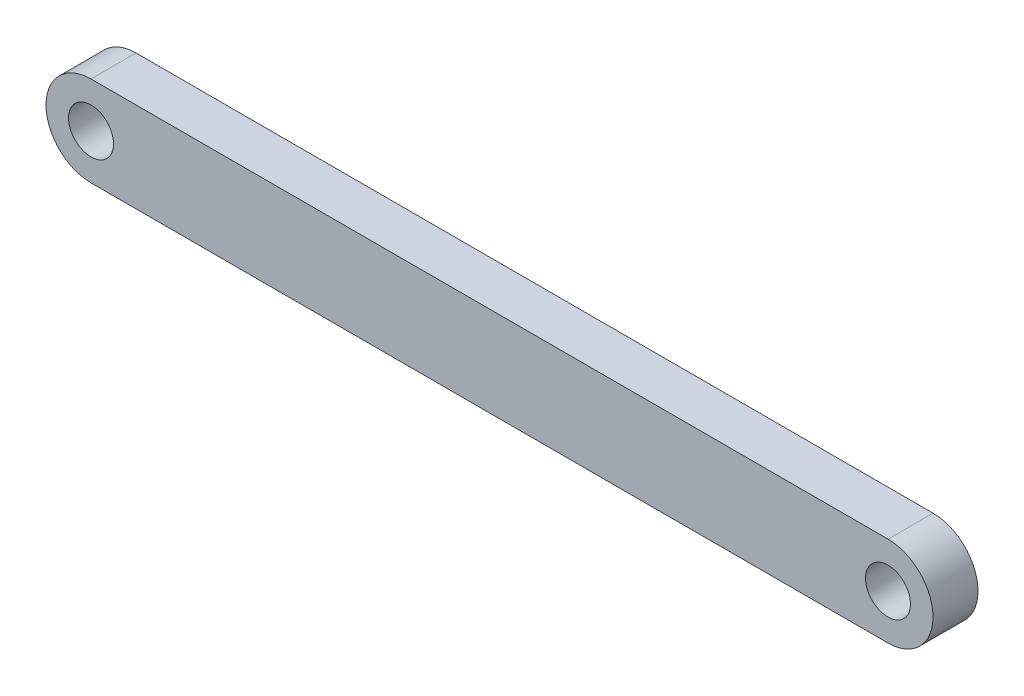
ISO-10303-21;
HEADER;
FILE_DESCRIPTION(('STEP AP214'),'2;1');
FILE_NAME('part.step','',(''),(''),'','','');
FILE_SCHEMA(('AUTOMOTIVE_DESIGN { 1 0 10303 214 1 1 1 1 }'));
ENDSEC;
DATA;
#1=APPLICATION_CONTEXT('core data for automotive mechanical design processes');
#2=APPLICATION_PROTOCOL_DEFINITION('international standard','automotive_design',2000,#1);
#3=PRODUCT_CONTEXT('',#1,'mechanical');
#4=PRODUCT('Part','Part','',(#3));
#5=PRODUCT_RELATED_PRODUCT_CATEGORY('part','',(#4));
#6=PRODUCT_DEFINITION_FORMATION('','',#4);
#7=PRODUCT_DEFINITION_CONTEXT('part definition',#1,'design');
#8=PRODUCT_DEFINITION('design','',#6,#7);
#9=PRODUCT_DEFINITION_SHAPE('','',#8);
#10=(LENGTH_UNIT() NAMED_UNIT(*) SI_UNIT(.MILLI.,.METRE.));
#11=(NAMED_UNIT(*) PLANE_ANGLE_UNIT() SI_UNIT($,.RADIAN.));
#12=(NAMED_UNIT(*) SI_UNIT($,.STERADIAN.) SOLID_ANGLE_UNIT());
#13=UNCERTAINTY_MEASURE_WITH_UNIT(LENGTH_MEASURE(1.E-05),#10,'distance_accuracy_value','');
#14=(GEOMETRIC_REPRESENTATION_CONTEXT(3) GLOBAL_UNCERTAINTY_ASSIGNED_CONTEXT((#13)) GLOBAL_UNIT_ASSIGNED_CONTEXT((#10,
#11,#12)) REPRESENTATION_CONTEXT('',''));
#15=CARTESIAN_POINT('',(0.,0.,0.));
#16=DIRECTION('',(0.,0.,1.));
#17=DIRECTION('',(1.,0.,0.));
#18=AXIS2_PLACEMENT_3D('',#15,#16,#17);
#19=CARTESIAN_POINT('',(-17.7099999764253,0.000913792037537602,2.));
#20=DIRECTION('',(0.,0.,1.));
#21=DIRECTION('',(1.,0.,0.));
#22=AXIS2_PLACEMENT_3D('',#19,#20,#21);
#23=PLANE('',#22);
#24=CARTESIAN_POINT('',(-17.7099999764253,0.000913792037537602,2.));
#25=DIRECTION('',(0.,0.,1.));
#26=DIRECTION('',(1.,0.,0.));
#27=AXIS2_PLACEMENT_3D('',#24,#25,#26);
#28=CIRCLE('',#27,1.);
#29=CARTESIAN_POINT('',(-16.7099999764253,0.000913792037537602,2.));
#30=VERTEX_POINT('',#29);
#31=EDGE_CURVE('E100',#30,#30,#28,.T.);
#32=ORIENTED_EDGE('',*,*,#31,.F.);
#33=EDGE_LOOP('',(#32));
#34=FACE_BOUND('',#33,.T.);
#35=CARTESIAN_POINT('',(-17.7099999764253,0.000913792037537602,2.));
#36=DIRECTION('',(0.,0.,1.));
#37=DIRECTION('',(1.,0.,0.));
#38=AXIS2_PLACEMENT_3D('',#35,#36,#37);
#39=CIRCLE('',#38,2.);
#40=CARTESIAN_POINT('',(-17.7099999764253,2.00091379203754,2.));
#41=VERTEX_POINT('',#40);
#42=CARTESIAN_POINT('',(-17.7099999764253,-1.99908620796246,2.));
#43=VERTEX_POINT('',#42);
#44=EDGE_CURVE('E85',#41,#43,#39,.T.);
#45=ORIENTED_EDGE('',*,*,#44,.T.);
#46=DIRECTION('',(1.,0.,0.));
#47=VECTOR('',#46,1.);
#48=CARTESIAN_POINT('',(-17.7099999764253,-1.99908620796246,2.));
#49=LINE('',#48,#47);
#50=CARTESIAN_POINT('',(17.7100000235747,-1.99908620796246,2.));
#51=VERTEX_POINT('',#50);
#52=EDGE_CURVE('E80',#43,#51,#49,.T.);
#53=ORIENTED_EDGE('',*,*,#52,.T.);
#54=CARTESIAN_POINT('',(17.7100000235747,0.000913792037537602,2.));
#55=DIRECTION('',(0.,0.,1.));
#56=DIRECTION('',(1.,0.,0.));
#57=AXIS2_PLACEMENT_3D('',#54,#55,#56);
#58=CIRCLE('',#57,2.);
#59=CARTESIAN_POINT('',(17.7100000235747,2.00091379203754,2.));
#60=VERTEX_POINT('',#59);
#61=EDGE_CURVE('E83',#51,#60,#58,.T.);
#62=ORIENTED_EDGE('',*,*,#61,.T.);
#63=DIRECTION('',(-1.,0.,0.));
#64=VECTOR('',#63,1.);
#65=CARTESIAN_POINT('',(-17.7099999764253,2.00091379203754,2.));
#66=LINE('',#65,#64);
#67=EDGE_CURVE('E50',#60,#41,#66,.T.);
#68=ORIENTED_EDGE('',*,*,#67,.T.);
#69=EDGE_LOOP('',(#45,#53,#62,#68));
#70=FACE_BOUND('',#69,.T.);
#71=CARTESIAN_POINT('',(17.7100000235747,0.000913792037537602,2.));
#72=DIRECTION('',(0.,0.,1.));
#73=DIRECTION('',(1.,0.,0.));
#74=AXIS2_PLACEMENT_3D('',#71,#72,#73);
#75=CIRCLE('',#74,1.);
#76=CARTESIAN_POINT('',(18.7100000235747,0.000913792037537602,2.));
#77=VERTEX_POINT('',#76);
#78=EDGE_CURVE('E115',#77,#77,#75,.T.);
#79=ORIENTED_EDGE('',*,*,#78,.F.);
#80=EDGE_LOOP('',(#79));
#81=FACE_BOUND('',#80,.T.);
#82=ADVANCED_FACE('F33',(#34,#70,#81),#23,.T.);
#83=CARTESIAN_POINT('',(-17.7099999764253,0.000913792037537602,0.));
#84=DIRECTION('',(0.,0.,1.));
#85=DIRECTION('',(1.,0.,0.));
#86=AXIS2_PLACEMENT_3D('',#83,#84,#85);
#87=PLANE('',#86);
#88=CARTESIAN_POINT('',(-17.7099999764253,0.000913792037537602,0.));
#89=DIRECTION('',(0.,0.,1.));
#90=DIRECTION('',(1.,0.,0.));
#91=AXIS2_PLACEMENT_3D('',#88,#89,#90);
#92=CIRCLE('',#91,2.);
#93=CARTESIAN_POINT('',(-17.7099999764253,2.00091379203754,0.));
#94=VERTEX_POINT('',#93);
#95=CARTESIAN_POINT('',(-17.7099999764253,-1.99908620796246,0.));
#96=VERTEX_POINT('',#95);
#97=EDGE_CURVE('E97',#94,#96,#92,.T.);
#98=ORIENTED_EDGE('',*,*,#97,.F.);
#99=DIRECTION('',(-1.,0.,0.));
#100=VECTOR('',#99,1.);
#101=CARTESIAN_POINT('',(-17.7099999764253,2.00091379203754,0.));
#102=LINE('',#101,#100);
#103=CARTESIAN_POINT('',(17.7100000235747,2.00091379203754,0.));
#104=VERTEX_POINT('',#103);
#105=EDGE_CURVE('E73',#104,#94,#102,.T.);
#106=ORIENTED_EDGE('',*,*,#105,.F.);
#107=CARTESIAN_POINT('',(17.7100000235747,0.000913792037537602,0.));
#108=DIRECTION('',(0.,0.,1.));
#109=DIRECTION('',(1.,0.,0.));
#110=AXIS2_PLACEMENT_3D('',#107,#108,#109);
#111=CIRCLE('',#110,2.);
#112=CARTESIAN_POINT('',(17.7100000235747,-1.99908620796246,0.));
#113=VERTEX_POINT('',#112);
#114=EDGE_CURVE('E67',#113,#104,#111,.T.);
#115=ORIENTED_EDGE('',*,*,#114,.F.);
#116=DIRECTION('',(1.,0.,0.));
#117=VECTOR('',#116,1.);
#118=CARTESIAN_POINT('',(-17.7099999764253,-1.99908620796246,0.));
#119=LINE('',#118,#117);
#120=EDGE_CURVE('E89',#96,#113,#119,.T.);
#121=ORIENTED_EDGE('',*,*,#120,.F.);
#122=EDGE_LOOP('',(#98,#106,#115,#121));
#123=FACE_BOUND('',#122,.T.);
#124=CARTESIAN_POINT('',(-17.7099999764253,0.000913792037537602,0.));
#125=DIRECTION('',(0.,0.,1.));
#126=DIRECTION('',(1.,0.,0.));
#127=AXIS2_PLACEMENT_3D('',#124,#125,#126);
#128=CIRCLE('',#127,1.);
#129=CARTESIAN_POINT('',(-16.7099999764253,0.000913792037537602,0.));
#130=VERTEX_POINT('',#129);
#131=EDGE_CURVE('E112',#130,#130,#128,.T.);
#132=ORIENTED_EDGE('',*,*,#131,.T.);
#133=EDGE_LOOP('',(#132));
#134=FACE_BOUND('',#133,.T.);
#135=CARTESIAN_POINT('',(17.7100000235747,0.000913792037537602,0.));
#136=DIRECTION('',(0.,0.,1.));
#137=DIRECTION('',(1.,0.,0.));
#138=AXIS2_PLACEMENT_3D('',#135,#136,#137);
#139=CIRCLE('',#138,1.);
#140=CARTESIAN_POINT('',(18.7100000235747,0.000913792037537602,0.));
#141=VERTEX_POINT('',#140);
#142=EDGE_CURVE('E118',#141,#141,#139,.T.);
#143=ORIENTED_EDGE('',*,*,#142,.T.);
#144=EDGE_LOOP('',(#143));
#145=FACE_BOUND('',#144,.T.);
#146=ADVANCED_FACE('F108',(#123,#134,#145),#87,.F.);
#147=CARTESIAN_POINT('',(-17.7099999764253,0.000913792037537602,2.));
#148=DIRECTION('',(0.,0.,-1.));
#149=DIRECTION('',(-1.,0.,0.));
#150=AXIS2_PLACEMENT_3D('',#147,#148,#149);
#151=CYLINDRICAL_SURFACE('',#150,2.);
#152=ORIENTED_EDGE('',*,*,#97,.T.);
#153=DIRECTION('',(0.,0.,-1.));
#154=VECTOR('',#153,1.);
#155=CARTESIAN_POINT('',(-17.7099999764253,-1.99908620796246,2.));
#156=LINE('',#155,#154);
#157=EDGE_CURVE('E11',#43,#96,#156,.T.);
#158=ORIENTED_EDGE('',*,*,#157,.F.);
#159=ORIENTED_EDGE('',*,*,#44,.F.);
#160=DIRECTION('',(0.,0.,-1.));
#161=VECTOR('',#160,1.);
#162=CARTESIAN_POINT('',(-17.7099999764253,2.00091379203754,2.));
#163=LINE('',#162,#161);
#164=EDGE_CURVE('E93',#41,#94,#163,.T.);
#165=ORIENTED_EDGE('',*,*,#164,.T.);
#166=EDGE_LOOP('',(#152,#158,#159,#165));
#167=FACE_BOUND('',#166,.T.);
#168=ADVANCED_FACE('F35',(#167),#151,.T.);
#169=CARTESIAN_POINT('',(-17.7099999764253,-1.99908620796246,2.));
#170=DIRECTION('',(0.,1.,0.));
#171=DIRECTION('',(0.,0.,1.));
#172=AXIS2_PLACEMENT_3D('',#169,#170,#171);
#173=PLANE('',#172);
#174=ORIENTED_EDGE('',*,*,#120,.T.);
#175=DIRECTION('',(0.,0.,-1.));
#176=VECTOR('',#175,1.);
#177=CARTESIAN_POINT('',(17.7100000235747,-1.99908620796246,2.));
#178=LINE('',#177,#176);
#179=EDGE_CURVE('E42',#51,#113,#178,.T.);
#180=ORIENTED_EDGE('',*,*,#179,.F.);
#181=ORIENTED_EDGE('',*,*,#52,.F.);
#182=ORIENTED_EDGE('',*,*,#157,.T.);
#183=EDGE_LOOP('',(#174,#180,#181,#182));
#184=FACE_BOUND('',#183,.T.);
#185=ADVANCED_FACE('F88',(#184),#173,.F.);
#186=CARTESIAN_POINT('',(17.7100000235747,0.000913792037537602,2.));
#187=DIRECTION('',(0.,0.,-1.));
#188=DIRECTION('',(-1.,0.,0.));
#189=AXIS2_PLACEMENT_3D('',#186,#187,#188);
#190=CYLINDRICAL_SURFACE('',#189,2.);
#191=ORIENTED_EDGE('',*,*,#114,.T.);
#192=DIRECTION('',(0.,0.,-1.));
#193=VECTOR('',#192,1.);
#194=CARTESIAN_POINT('',(17.7100000235747,2.00091379203754,2.));
#195=LINE('',#194,#193);
#196=EDGE_CURVE('E90',#60,#104,#195,.T.);
#197=ORIENTED_EDGE('',*,*,#196,.F.);
#198=ORIENTED_EDGE('',*,*,#61,.F.);
#199=ORIENTED_EDGE('',*,*,#179,.T.);
#200=EDGE_LOOP('',(#191,#197,#198,#199));
#201=FACE_BOUND('',#200,.T.);
#202=ADVANCED_FACE('F91',(#201),#190,.T.);
#203=CARTESIAN_POINT('',(-17.7099999764253,2.00091379203754,2.));
#204=DIRECTION('',(0.,-1.,0.));
#205=DIRECTION('',(0.,0.,-1.));
#206=AXIS2_PLACEMENT_3D('',#203,#204,#205);
#207=PLANE('',#206);
#208=ORIENTED_EDGE('',*,*,#105,.T.);
#209=ORIENTED_EDGE('',*,*,#164,.F.);
#210=ORIENTED_EDGE('',*,*,#67,.F.);
#211=ORIENTED_EDGE('',*,*,#196,.T.);
#212=EDGE_LOOP('',(#208,#209,#210,#211));
#213=FACE_BOUND('',#212,.T.);
#214=ADVANCED_FACE('F105',(#213),#207,.F.);
#215=CARTESIAN_POINT('',(-17.7099999764253,0.000913792037537602,2.));
#216=DIRECTION('',(0.,0.,-1.));
#217=DIRECTION('',(-1.,0.,0.));
#218=AXIS2_PLACEMENT_3D('',#215,#216,#217);
#219=CYLINDRICAL_SURFACE('',#218,1.);
#220=ORIENTED_EDGE('',*,*,#31,.T.);
#221=EDGE_LOOP('',(#220));
#222=FACE_BOUND('',#221,.T.);
#223=ORIENTED_EDGE('',*,*,#131,.F.);
#224=EDGE_LOOP('',(#223));
#225=FACE_BOUND('',#224,.T.);
#226=ADVANCED_FACE('F135',(#222,#225),#219,.F.);
#227=CARTESIAN_POINT('',(17.7100000235747,0.000913792037537602,2.));
#228=DIRECTION('',(0.,0.,-1.));
#229=DIRECTION('',(-1.,0.,0.));
#230=AXIS2_PLACEMENT_3D('',#227,#228,#229);
#231=CYLINDRICAL_SURFACE('',#230,1.);
#232=ORIENTED_EDGE('',*,*,#78,.T.);
#233=EDGE_LOOP('',(#232));
#234=FACE_BOUND('',#233,.T.);
#235=ORIENTED_EDGE('',*,*,#142,.F.);
#236=EDGE_LOOP('',(#235));
#237=FACE_BOUND('',#236,.T.);
#238=ADVANCED_FACE('F124',(#234,#237),#231,.F.);
#239=CLOSED_SHELL('',(#82,#146,#168,#185,#202,#214,#226,#238));
#240=MANIFOLD_SOLID_BREP('B2',#239);
#241=ADVANCED_BREP_SHAPE_REPRESENTATION('',(#18,#240),#14);
#242=SHAPE_DEFINITION_REPRESENTATION(#9,#241);
ENDSEC;
END-ISO-10303-21;
